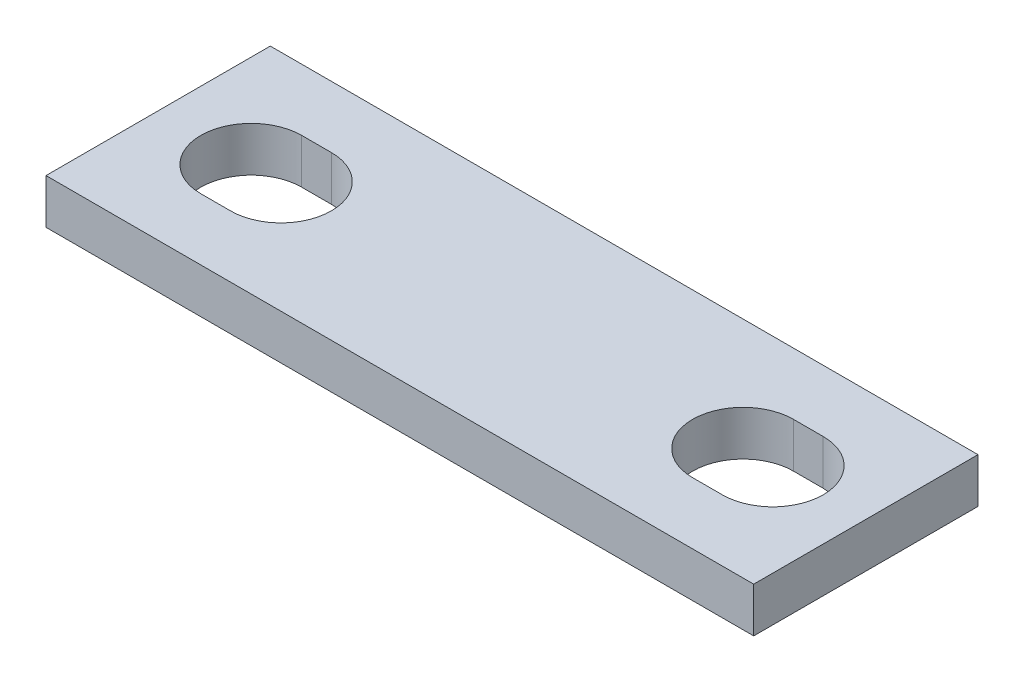
ISO-10303-21;
HEADER;
FILE_DESCRIPTION(('STEP AP214'),'2;1');
FILE_NAME('part.step','',(''),(''),'','','');
FILE_SCHEMA(('AUTOMOTIVE_DESIGN { 1 0 10303 214 1 1 1 1 }'));
ENDSEC;
DATA;
#1=APPLICATION_CONTEXT('core data for automotive mechanical design processes');
#2=APPLICATION_PROTOCOL_DEFINITION('international standard','automotive_design',2000,#1);
#3=PRODUCT_CONTEXT('',#1,'mechanical');
#4=PRODUCT('Part','Part','',(#3));
#5=PRODUCT_RELATED_PRODUCT_CATEGORY('part','',(#4));
#6=PRODUCT_DEFINITION_FORMATION('','',#4);
#7=PRODUCT_DEFINITION_CONTEXT('part definition',#1,'design');
#8=PRODUCT_DEFINITION('design','',#6,#7);
#9=PRODUCT_DEFINITION_SHAPE('','',#8);
#10=(LENGTH_UNIT() NAMED_UNIT(*) SI_UNIT(.MILLI.,.METRE.));
#11=(NAMED_UNIT(*) PLANE_ANGLE_UNIT() SI_UNIT($,.RADIAN.));
#12=(NAMED_UNIT(*) SI_UNIT($,.STERADIAN.) SOLID_ANGLE_UNIT());
#13=UNCERTAINTY_MEASURE_WITH_UNIT(LENGTH_MEASURE(1.E-05),#10,'distance_accuracy_value','');
#14=(GEOMETRIC_REPRESENTATION_CONTEXT(3) GLOBAL_UNCERTAINTY_ASSIGNED_CONTEXT((#13)) GLOBAL_UNIT_ASSIGNED_CONTEXT((#10,
#11,#12)) REPRESENTATION_CONTEXT('',''));
#15=CARTESIAN_POINT('',(0.,0.,0.));
#16=DIRECTION('',(0.,0.,1.));
#17=DIRECTION('',(1.,0.,0.));
#18=AXIS2_PLACEMENT_3D('',#15,#16,#17);
#19=CARTESIAN_POINT('',(0.,2.,0.));
#20=DIRECTION('',(0.,1.,0.));
#21=DIRECTION('',(0.,0.,1.));
#22=AXIS2_PLACEMENT_3D('',#19,#20,#21);
#23=PLANE('',#22);
#24=DIRECTION('',(0.,0.,1.));
#25=VECTOR('',#24,1.);
#26=CARTESIAN_POINT('',(-15.775,2.,5.));
#27=LINE('',#26,#25);
#28=CARTESIAN_POINT('',(-15.775,2.,-5.));
#29=VERTEX_POINT('',#28);
#30=CARTESIAN_POINT('',(-15.775,2.,5.));
#31=VERTEX_POINT('',#30);
#32=EDGE_CURVE('E193',#29,#31,#27,.T.);
#33=ORIENTED_EDGE('',*,*,#32,.T.);
#34=DIRECTION('',(1.,0.,0.));
#35=VECTOR('',#34,1.);
#36=CARTESIAN_POINT('',(15.775,2.,5.));
#37=LINE('',#36,#35);
#38=CARTESIAN_POINT('',(15.775,2.,5.));
#39=VERTEX_POINT('',#38);
#40=EDGE_CURVE('E196',#31,#39,#37,.T.);
#41=ORIENTED_EDGE('',*,*,#40,.T.);
#42=DIRECTION('',(0.,0.,-1.));
#43=VECTOR('',#42,1.);
#44=CARTESIAN_POINT('',(15.775,2.,5.));
#45=LINE('',#44,#43);
#46=CARTESIAN_POINT('',(15.775,2.,-5.));
#47=VERTEX_POINT('',#46);
#48=EDGE_CURVE('E199',#39,#47,#45,.T.);
#49=ORIENTED_EDGE('',*,*,#48,.T.);
#50=DIRECTION('',(-1.,0.,0.));
#51=VECTOR('',#50,1.);
#52=CARTESIAN_POINT('',(15.775,2.,-5.));
#53=LINE('',#52,#51);
#54=EDGE_CURVE('E201',#47,#29,#53,.T.);
#55=ORIENTED_EDGE('',*,*,#54,.T.);
#56=EDGE_LOOP('',(#33,#41,#49,#55));
#57=FACE_BOUND('',#56,.T.);
#58=DIRECTION('',(1.,0.,0.));
#59=VECTOR('',#58,1.);
#60=CARTESIAN_POINT('',(-11.625,2.,2.25));
#61=LINE('',#60,#59);
#62=CARTESIAN_POINT('',(-11.625,2.,2.25));
#63=VERTEX_POINT('',#62);
#64=CARTESIAN_POINT('',(-10.3,2.,2.25));
#65=VERTEX_POINT('',#64);
#66=EDGE_CURVE('E164',#63,#65,#61,.T.);
#67=ORIENTED_EDGE('',*,*,#66,.F.);
#68=CARTESIAN_POINT('',(-11.625,2.,0.));
#69=DIRECTION('',(0.,1.,0.));
#70=DIRECTION('',(0.,0.,1.));
#71=AXIS2_PLACEMENT_3D('',#68,#69,#70);
#72=CIRCLE('',#71,2.25);
#73=CARTESIAN_POINT('',(-11.625,2.,-2.25));
#74=VERTEX_POINT('',#73);
#75=EDGE_CURVE('E162',#74,#63,#72,.T.);
#76=ORIENTED_EDGE('',*,*,#75,.F.);
#77=DIRECTION('',(-1.,0.,0.));
#78=VECTOR('',#77,1.);
#79=CARTESIAN_POINT('',(-11.625,2.,-2.25));
#80=LINE('',#79,#78);
#81=CARTESIAN_POINT('',(-10.3,2.,-2.25));
#82=VERTEX_POINT('',#81);
#83=EDGE_CURVE('E170',#82,#74,#80,.T.);
#84=ORIENTED_EDGE('',*,*,#83,.F.);
#85=CARTESIAN_POINT('',(-10.3,2.,0.));
#86=DIRECTION('',(0.,1.,0.));
#87=DIRECTION('',(0.,0.,1.));
#88=AXIS2_PLACEMENT_3D('',#85,#86,#87);
#89=CIRCLE('',#88,2.25);
#90=EDGE_CURVE('E167',#65,#82,#89,.T.);
#91=ORIENTED_EDGE('',*,*,#90,.F.);
#92=EDGE_LOOP('',(#67,#76,#84,#91));
#93=FACE_BOUND('',#92,.T.);
#94=DIRECTION('',(-1.,0.,0.));
#95=VECTOR('',#94,1.);
#96=CARTESIAN_POINT('',(11.625,2.,-2.25));
#97=LINE('',#96,#95);
#98=CARTESIAN_POINT('',(11.625,2.,-2.25));
#99=VERTEX_POINT('',#98);
#100=CARTESIAN_POINT('',(10.3,2.,-2.25));
#101=VERTEX_POINT('',#100);
#102=EDGE_CURVE('E134',#99,#101,#97,.T.);
#103=ORIENTED_EDGE('',*,*,#102,.F.);
#104=CARTESIAN_POINT('',(11.625,2.,0.));
#105=DIRECTION('',(0.,1.,0.));
#106=DIRECTION('',(0.,0.,1.));
#107=AXIS2_PLACEMENT_3D('',#104,#105,#106);
#108=CIRCLE('',#107,2.25);
#109=CARTESIAN_POINT('',(11.625,2.,2.25));
#110=VERTEX_POINT('',#109);
#111=EDGE_CURVE('E126',#110,#99,#108,.T.);
#112=ORIENTED_EDGE('',*,*,#111,.F.);
#113=DIRECTION('',(1.,0.,0.));
#114=VECTOR('',#113,1.);
#115=CARTESIAN_POINT('',(11.625,2.,2.25));
#116=LINE('',#115,#114);
#117=CARTESIAN_POINT('',(10.3,2.,2.25));
#118=VERTEX_POINT('',#117);
#119=EDGE_CURVE('E148',#118,#110,#116,.T.);
#120=ORIENTED_EDGE('',*,*,#119,.F.);
#121=CARTESIAN_POINT('',(10.3,2.,0.));
#122=DIRECTION('',(0.,1.,0.));
#123=DIRECTION('',(0.,0.,1.));
#124=AXIS2_PLACEMENT_3D('',#121,#122,#123);
#125=CIRCLE('',#124,2.25);
#126=EDGE_CURVE('E146',#101,#118,#125,.T.);
#127=ORIENTED_EDGE('',*,*,#126,.F.);
#128=EDGE_LOOP('',(#103,#112,#120,#127));
#129=FACE_BOUND('',#128,.T.);
#130=ADVANCED_FACE('F37',(#57,#93,#129),#23,.T.);
#131=CARTESIAN_POINT('',(0.,0.,0.));
#132=DIRECTION('',(0.,1.,0.));
#133=DIRECTION('',(0.,0.,1.));
#134=AXIS2_PLACEMENT_3D('',#131,#132,#133);
#135=PLANE('',#134);
#136=CARTESIAN_POINT('',(-11.625,0.,0.));
#137=DIRECTION('',(0.,1.,0.));
#138=DIRECTION('',(0.,0.,1.));
#139=AXIS2_PLACEMENT_3D('',#136,#137,#138);
#140=CIRCLE('',#139,2.25);
#141=CARTESIAN_POINT('',(-11.625,0.,-2.25));
#142=VERTEX_POINT('',#141);
#143=CARTESIAN_POINT('',(-11.625,0.,2.25));
#144=VERTEX_POINT('',#143);
#145=EDGE_CURVE('E142',#142,#144,#140,.T.);
#146=ORIENTED_EDGE('',*,*,#145,.T.);
#147=DIRECTION('',(1.,0.,0.));
#148=VECTOR('',#147,1.);
#149=CARTESIAN_POINT('',(-11.625,0.,2.25));
#150=LINE('',#149,#148);
#151=CARTESIAN_POINT('',(-10.3,0.,2.25));
#152=VERTEX_POINT('',#151);
#153=EDGE_CURVE('E175',#144,#152,#150,.T.);
#154=ORIENTED_EDGE('',*,*,#153,.T.);
#155=CARTESIAN_POINT('',(-10.3,0.,0.));
#156=DIRECTION('',(0.,1.,0.));
#157=DIRECTION('',(0.,0.,1.));
#158=AXIS2_PLACEMENT_3D('',#155,#156,#157);
#159=CIRCLE('',#158,2.25);
#160=CARTESIAN_POINT('',(-10.3,0.,-2.25));
#161=VERTEX_POINT('',#160);
#162=EDGE_CURVE('E178',#152,#161,#159,.T.);
#163=ORIENTED_EDGE('',*,*,#162,.T.);
#164=DIRECTION('',(-1.,0.,0.));
#165=VECTOR('',#164,1.);
#166=CARTESIAN_POINT('',(-11.625,0.,-2.25));
#167=LINE('',#166,#165);
#168=EDGE_CURVE('E165',#161,#142,#167,.T.);
#169=ORIENTED_EDGE('',*,*,#168,.T.);
#170=EDGE_LOOP('',(#146,#154,#163,#169));
#171=FACE_BOUND('',#170,.T.);
#172=DIRECTION('',(0.,0.,1.));
#173=VECTOR('',#172,1.);
#174=CARTESIAN_POINT('',(-15.775,0.,5.));
#175=LINE('',#174,#173);
#176=CARTESIAN_POINT('',(-15.775,0.,-5.));
#177=VERTEX_POINT('',#176);
#178=CARTESIAN_POINT('',(-15.775,0.,5.));
#179=VERTEX_POINT('',#178);
#180=EDGE_CURVE('E192',#177,#179,#175,.T.);
#181=ORIENTED_EDGE('',*,*,#180,.F.);
#182=DIRECTION('',(-1.,0.,0.));
#183=VECTOR('',#182,1.);
#184=CARTESIAN_POINT('',(15.775,0.,-5.));
#185=LINE('',#184,#183);
#186=CARTESIAN_POINT('',(15.775,0.,-5.));
#187=VERTEX_POINT('',#186);
#188=EDGE_CURVE('E197',#187,#177,#185,.T.);
#189=ORIENTED_EDGE('',*,*,#188,.F.);
#190=DIRECTION('',(0.,0.,-1.));
#191=VECTOR('',#190,1.);
#192=CARTESIAN_POINT('',(15.775,0.,5.));
#193=LINE('',#192,#191);
#194=CARTESIAN_POINT('',(15.775,0.,5.));
#195=VERTEX_POINT('',#194);
#196=EDGE_CURVE('E208',#195,#187,#193,.T.);
#197=ORIENTED_EDGE('',*,*,#196,.F.);
#198=DIRECTION('',(1.,0.,0.));
#199=VECTOR('',#198,1.);
#200=CARTESIAN_POINT('',(15.775,0.,5.));
#201=LINE('',#200,#199);
#202=EDGE_CURVE('E206',#179,#195,#201,.T.);
#203=ORIENTED_EDGE('',*,*,#202,.F.);
#204=EDGE_LOOP('',(#181,#189,#197,#203));
#205=FACE_BOUND('',#204,.T.);
#206=CARTESIAN_POINT('',(11.625,0.,0.));
#207=DIRECTION('',(0.,1.,0.));
#208=DIRECTION('',(0.,0.,1.));
#209=AXIS2_PLACEMENT_3D('',#206,#207,#208);
#210=CIRCLE('',#209,2.25);
#211=CARTESIAN_POINT('',(11.625,0.,2.25));
#212=VERTEX_POINT('',#211);
#213=CARTESIAN_POINT('',(11.625,0.,-2.25));
#214=VERTEX_POINT('',#213);
#215=EDGE_CURVE('E60',#212,#214,#210,.T.);
#216=ORIENTED_EDGE('',*,*,#215,.T.);
#217=DIRECTION('',(-1.,0.,0.));
#218=VECTOR('',#217,1.);
#219=CARTESIAN_POINT('',(11.625,0.,-2.25));
#220=LINE('',#219,#218);
#221=CARTESIAN_POINT('',(10.3,0.,-2.25));
#222=VERTEX_POINT('',#221);
#223=EDGE_CURVE('E141',#214,#222,#220,.T.);
#224=ORIENTED_EDGE('',*,*,#223,.T.);
#225=CARTESIAN_POINT('',(10.3,0.,0.));
#226=DIRECTION('',(0.,1.,0.));
#227=DIRECTION('',(0.,0.,1.));
#228=AXIS2_PLACEMENT_3D('',#225,#226,#227);
#229=CIRCLE('',#228,2.25);
#230=CARTESIAN_POINT('',(10.3,0.,2.25));
#231=VERTEX_POINT('',#230);
#232=EDGE_CURVE('E154',#222,#231,#229,.T.);
#233=ORIENTED_EDGE('',*,*,#232,.T.);
#234=DIRECTION('',(1.,0.,0.));
#235=VECTOR('',#234,1.);
#236=CARTESIAN_POINT('',(11.625,0.,2.25));
#237=LINE('',#236,#235);
#238=EDGE_CURVE('E135',#231,#212,#237,.T.);
#239=ORIENTED_EDGE('',*,*,#238,.T.);
#240=EDGE_LOOP('',(#216,#224,#233,#239));
#241=FACE_BOUND('',#240,.T.);
#242=ADVANCED_FACE('F226',(#171,#205,#241),#135,.F.);
#243=CARTESIAN_POINT('',(-15.775,2.,5.));
#244=DIRECTION('',(1.,0.,0.));
#245=DIRECTION('',(0.,0.,-1.));
#246=AXIS2_PLACEMENT_3D('',#243,#244,#245);
#247=PLANE('',#246);
#248=ORIENTED_EDGE('',*,*,#180,.T.);
#249=DIRECTION('',(0.,-1.,0.));
#250=VECTOR('',#249,1.);
#251=CARTESIAN_POINT('',(-15.775,2.,5.));
#252=LINE('',#251,#250);
#253=EDGE_CURVE('E11',#31,#179,#252,.T.);
#254=ORIENTED_EDGE('',*,*,#253,.F.);
#255=ORIENTED_EDGE('',*,*,#32,.F.);
#256=DIRECTION('',(0.,-1.,0.));
#257=VECTOR('',#256,1.);
#258=CARTESIAN_POINT('',(-15.775,2.,-5.));
#259=LINE('',#258,#257);
#260=EDGE_CURVE('E203',#29,#177,#259,.T.);
#261=ORIENTED_EDGE('',*,*,#260,.T.);
#262=EDGE_LOOP('',(#248,#254,#255,#261));
#263=FACE_BOUND('',#262,.T.);
#264=ADVANCED_FACE('F39',(#263),#247,.F.);
#265=CARTESIAN_POINT('',(15.775,2.,5.));
#266=DIRECTION('',(0.,0.,-1.));
#267=DIRECTION('',(-1.,0.,0.));
#268=AXIS2_PLACEMENT_3D('',#265,#266,#267);
#269=PLANE('',#268);
#270=ORIENTED_EDGE('',*,*,#202,.T.);
#271=DIRECTION('',(0.,-1.,0.));
#272=VECTOR('',#271,1.);
#273=CARTESIAN_POINT('',(15.775,2.,5.));
#274=LINE('',#273,#272);
#275=EDGE_CURVE('E45',#39,#195,#274,.T.);
#276=ORIENTED_EDGE('',*,*,#275,.F.);
#277=ORIENTED_EDGE('',*,*,#40,.F.);
#278=ORIENTED_EDGE('',*,*,#253,.T.);
#279=EDGE_LOOP('',(#270,#276,#277,#278));
#280=FACE_BOUND('',#279,.T.);
#281=ADVANCED_FACE('F237',(#280),#269,.F.);
#282=CARTESIAN_POINT('',(15.775,2.,5.));
#283=DIRECTION('',(-1.,0.,0.));
#284=DIRECTION('',(0.,0.,1.));
#285=AXIS2_PLACEMENT_3D('',#282,#283,#284);
#286=PLANE('',#285);
#287=ORIENTED_EDGE('',*,*,#196,.T.);
#288=DIRECTION('',(0.,-1.,0.));
#289=VECTOR('',#288,1.);
#290=CARTESIAN_POINT('',(15.775,2.,-5.));
#291=LINE('',#290,#289);
#292=EDGE_CURVE('E213',#47,#187,#291,.T.);
#293=ORIENTED_EDGE('',*,*,#292,.F.);
#294=ORIENTED_EDGE('',*,*,#48,.F.);
#295=ORIENTED_EDGE('',*,*,#275,.T.);
#296=EDGE_LOOP('',(#287,#293,#294,#295));
#297=FACE_BOUND('',#296,.T.);
#298=ADVANCED_FACE('F220',(#297),#286,.F.);
#299=CARTESIAN_POINT('',(15.775,2.,-5.));
#300=DIRECTION('',(0.,0.,1.));
#301=DIRECTION('',(1.,0.,0.));
#302=AXIS2_PLACEMENT_3D('',#299,#300,#301);
#303=PLANE('',#302);
#304=ORIENTED_EDGE('',*,*,#188,.T.);
#305=ORIENTED_EDGE('',*,*,#260,.F.);
#306=ORIENTED_EDGE('',*,*,#54,.F.);
#307=ORIENTED_EDGE('',*,*,#292,.T.);
#308=EDGE_LOOP('',(#304,#305,#306,#307));
#309=FACE_BOUND('',#308,.T.);
#310=ADVANCED_FACE('F230',(#309),#303,.F.);
#311=CARTESIAN_POINT('',(-11.625,2.,0.));
#312=DIRECTION('',(0.,-1.,0.));
#313=DIRECTION('',(0.,0.,-1.));
#314=AXIS2_PLACEMENT_3D('',#311,#312,#313);
#315=CYLINDRICAL_SURFACE('',#314,2.25);
#316=ORIENTED_EDGE('',*,*,#145,.F.);
#317=DIRECTION('',(0.,-1.,0.));
#318=VECTOR('',#317,1.);
#319=CARTESIAN_POINT('',(-11.625,2.,-2.25));
#320=LINE('',#319,#318);
#321=EDGE_CURVE('E172',#74,#142,#320,.T.);
#322=ORIENTED_EDGE('',*,*,#321,.F.);
#323=ORIENTED_EDGE('',*,*,#75,.T.);
#324=DIRECTION('',(0.,-1.,0.));
#325=VECTOR('',#324,1.);
#326=CARTESIAN_POINT('',(-11.625,2.,2.25));
#327=LINE('',#326,#325);
#328=EDGE_CURVE('E189',#63,#144,#327,.T.);
#329=ORIENTED_EDGE('',*,*,#328,.T.);
#330=EDGE_LOOP('',(#316,#322,#323,#329));
#331=FACE_BOUND('',#330,.T.);
#332=ADVANCED_FACE('F252',(#331),#315,.F.);
#333=CARTESIAN_POINT('',(-11.625,2.,2.25));
#334=DIRECTION('',(0.,0.,-1.));
#335=DIRECTION('',(-1.,0.,0.));
#336=AXIS2_PLACEMENT_3D('',#333,#334,#335);
#337=PLANE('',#336);
#338=ORIENTED_EDGE('',*,*,#153,.F.);
#339=ORIENTED_EDGE('',*,*,#328,.F.);
#340=ORIENTED_EDGE('',*,*,#66,.T.);
#341=DIRECTION('',(0.,-1.,0.));
#342=VECTOR('',#341,1.);
#343=CARTESIAN_POINT('',(-10.3,2.,2.25));
#344=LINE('',#343,#342);
#345=EDGE_CURVE('E187',#65,#152,#344,.T.);
#346=ORIENTED_EDGE('',*,*,#345,.T.);
#347=EDGE_LOOP('',(#338,#339,#340,#346));
#348=FACE_BOUND('',#347,.T.);
#349=ADVANCED_FACE('F259',(#348),#337,.T.);
#350=CARTESIAN_POINT('',(-10.3,2.,0.));
#351=DIRECTION('',(0.,-1.,0.));
#352=DIRECTION('',(0.,0.,-1.));
#353=AXIS2_PLACEMENT_3D('',#350,#351,#352);
#354=CYLINDRICAL_SURFACE('',#353,2.25);
#355=ORIENTED_EDGE('',*,*,#162,.F.);
#356=ORIENTED_EDGE('',*,*,#345,.F.);
#357=ORIENTED_EDGE('',*,*,#90,.T.);
#358=DIRECTION('',(0.,-1.,0.));
#359=VECTOR('',#358,1.);
#360=CARTESIAN_POINT('',(-10.3,2.,-2.25));
#361=LINE('',#360,#359);
#362=EDGE_CURVE('E185',#82,#161,#361,.T.);
#363=ORIENTED_EDGE('',*,*,#362,.T.);
#364=EDGE_LOOP('',(#355,#356,#357,#363));
#365=FACE_BOUND('',#364,.T.);
#366=ADVANCED_FACE('F264',(#365),#354,.F.);
#367=CARTESIAN_POINT('',(-11.625,2.,-2.25));
#368=DIRECTION('',(0.,0.,1.));
#369=DIRECTION('',(1.,0.,0.));
#370=AXIS2_PLACEMENT_3D('',#367,#368,#369);
#371=PLANE('',#370);
#372=ORIENTED_EDGE('',*,*,#168,.F.);
#373=ORIENTED_EDGE('',*,*,#362,.F.);
#374=ORIENTED_EDGE('',*,*,#83,.T.);
#375=ORIENTED_EDGE('',*,*,#321,.T.);
#376=EDGE_LOOP('',(#372,#373,#374,#375));
#377=FACE_BOUND('',#376,.T.);
#378=ADVANCED_FACE('F271',(#377),#371,.T.);
#379=CARTESIAN_POINT('',(11.625,2.,0.));
#380=DIRECTION('',(0.,-1.,0.));
#381=DIRECTION('',(0.,0.,-1.));
#382=AXIS2_PLACEMENT_3D('',#379,#380,#381);
#383=CYLINDRICAL_SURFACE('',#382,2.25);
#384=ORIENTED_EDGE('',*,*,#215,.F.);
#385=DIRECTION('',(0.,-1.,0.));
#386=VECTOR('',#385,1.);
#387=CARTESIAN_POINT('',(11.625,2.,2.25));
#388=LINE('',#387,#386);
#389=EDGE_CURVE('E130',#110,#212,#388,.T.);
#390=ORIENTED_EDGE('',*,*,#389,.F.);
#391=ORIENTED_EDGE('',*,*,#111,.T.);
#392=DIRECTION('',(0.,-1.,0.));
#393=VECTOR('',#392,1.);
#394=CARTESIAN_POINT('',(11.625,2.,-2.25));
#395=LINE('',#394,#393);
#396=EDGE_CURVE('E129',#99,#214,#395,.T.);
#397=ORIENTED_EDGE('',*,*,#396,.T.);
#398=EDGE_LOOP('',(#384,#390,#391,#397));
#399=FACE_BOUND('',#398,.T.);
#400=ADVANCED_FACE('F128',(#399),#383,.F.);
#401=CARTESIAN_POINT('',(11.625,2.,-2.25));
#402=DIRECTION('',(0.,0.,1.));
#403=DIRECTION('',(1.,0.,0.));
#404=AXIS2_PLACEMENT_3D('',#401,#402,#403);
#405=PLANE('',#404);
#406=ORIENTED_EDGE('',*,*,#223,.F.);
#407=ORIENTED_EDGE('',*,*,#396,.F.);
#408=ORIENTED_EDGE('',*,*,#102,.T.);
#409=DIRECTION('',(0.,-1.,0.));
#410=VECTOR('',#409,1.);
#411=CARTESIAN_POINT('',(10.3,2.,-2.25));
#412=LINE('',#411,#410);
#413=EDGE_CURVE('E143',#101,#222,#412,.T.);
#414=ORIENTED_EDGE('',*,*,#413,.T.);
#415=EDGE_LOOP('',(#406,#407,#408,#414));
#416=FACE_BOUND('',#415,.T.);
#417=ADVANCED_FACE('F138',(#416),#405,.T.);
#418=CARTESIAN_POINT('',(10.3,2.,0.));
#419=DIRECTION('',(0.,-1.,0.));
#420=DIRECTION('',(0.,0.,-1.));
#421=AXIS2_PLACEMENT_3D('',#418,#419,#420);
#422=CYLINDRICAL_SURFACE('',#421,2.25);
#423=ORIENTED_EDGE('',*,*,#232,.F.);
#424=ORIENTED_EDGE('',*,*,#413,.F.);
#425=ORIENTED_EDGE('',*,*,#126,.T.);
#426=DIRECTION('',(0.,-1.,0.));
#427=VECTOR('',#426,1.);
#428=CARTESIAN_POINT('',(10.3,2.,2.25));
#429=LINE('',#428,#427);
#430=EDGE_CURVE('E52',#118,#231,#429,.T.);
#431=ORIENTED_EDGE('',*,*,#430,.T.);
#432=EDGE_LOOP('',(#423,#424,#425,#431));
#433=FACE_BOUND('',#432,.T.);
#434=ADVANCED_FACE('F289',(#433),#422,.F.);
#435=CARTESIAN_POINT('',(11.625,2.,2.25));
#436=DIRECTION('',(0.,0.,-1.));
#437=DIRECTION('',(-1.,0.,0.));
#438=AXIS2_PLACEMENT_3D('',#435,#436,#437);
#439=PLANE('',#438);
#440=ORIENTED_EDGE('',*,*,#238,.F.);
#441=ORIENTED_EDGE('',*,*,#430,.F.);
#442=ORIENTED_EDGE('',*,*,#119,.T.);
#443=ORIENTED_EDGE('',*,*,#389,.T.);
#444=EDGE_LOOP('',(#440,#441,#442,#443));
#445=FACE_BOUND('',#444,.T.);
#446=ADVANCED_FACE('F292',(#445),#439,.T.);
#447=CLOSED_SHELL('',(#130,#242,#264,#281,#298,#310,#332,#349,#366,#378,#400,#417,#434,#446));
#448=MANIFOLD_SOLID_BREP('B2',#447);
#449=ADVANCED_BREP_SHAPE_REPRESENTATION('',(#18,#448),#14);
#450=SHAPE_DEFINITION_REPRESENTATION(#9,#449);
ENDSEC;
END-ISO-10303-21;
